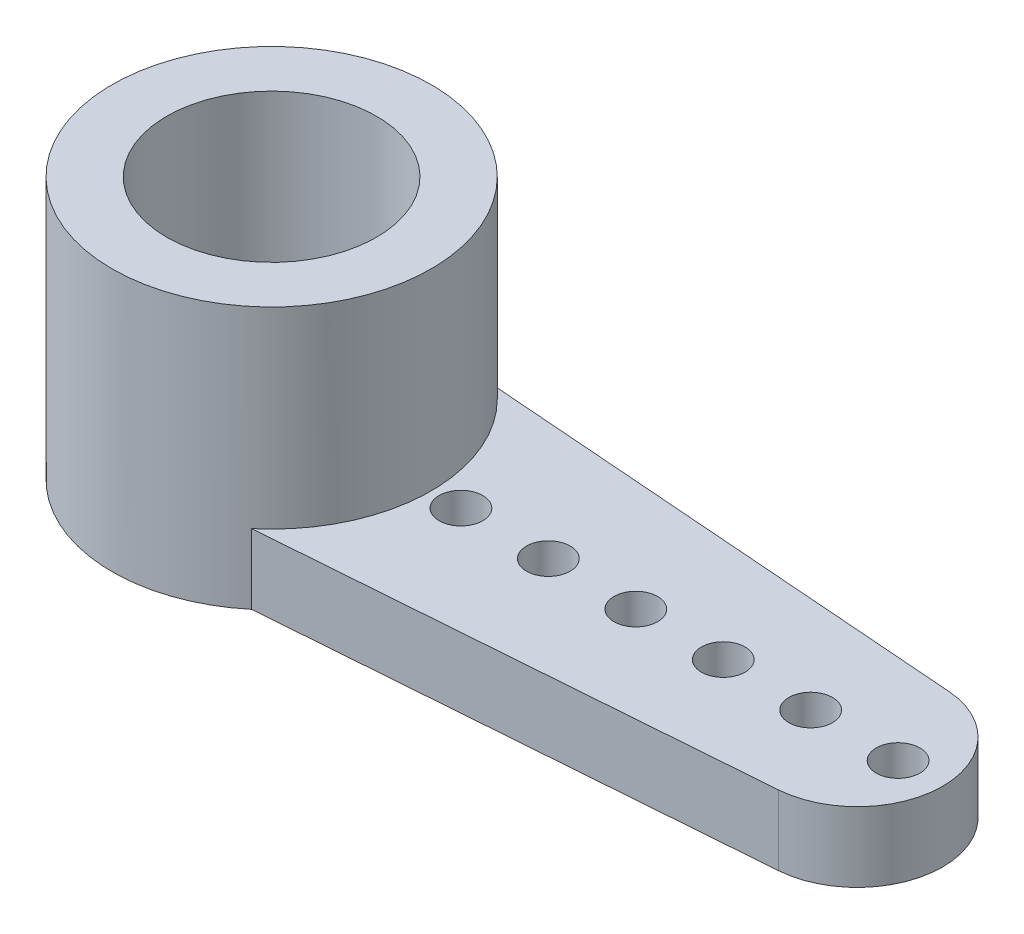
ISO-10303-21;
HEADER;
FILE_DESCRIPTION(('STEP AP214'),'2;1');
FILE_NAME('part.step','',(''),(''),'','','');
FILE_SCHEMA(('AUTOMOTIVE_DESIGN { 1 0 10303 214 1 1 1 1 }'));
ENDSEC;
DATA;
#1=APPLICATION_CONTEXT('core data for automotive mechanical design processes');
#2=APPLICATION_PROTOCOL_DEFINITION('international standard','automotive_design',2000,#1);
#3=PRODUCT_CONTEXT('',#1,'mechanical');
#4=PRODUCT('Part','Part','',(#3));
#5=PRODUCT_RELATED_PRODUCT_CATEGORY('part','',(#4));
#6=PRODUCT_DEFINITION_FORMATION('','',#4);
#7=PRODUCT_DEFINITION_CONTEXT('part definition',#1,'design');
#8=PRODUCT_DEFINITION('design','',#6,#7);
#9=PRODUCT_DEFINITION_SHAPE('','',#8);
#10=(LENGTH_UNIT() NAMED_UNIT(*) SI_UNIT(.MILLI.,.METRE.));
#11=(NAMED_UNIT(*) PLANE_ANGLE_UNIT() SI_UNIT($,.RADIAN.));
#12=(NAMED_UNIT(*) SI_UNIT($,.STERADIAN.) SOLID_ANGLE_UNIT());
#13=UNCERTAINTY_MEASURE_WITH_UNIT(LENGTH_MEASURE(1.E-05),#10,'distance_accuracy_value','');
#14=(GEOMETRIC_REPRESENTATION_CONTEXT(3) GLOBAL_UNCERTAINTY_ASSIGNED_CONTEXT((#13)) GLOBAL_UNIT_ASSIGNED_CONTEXT((#10,
#11,#12)) REPRESENTATION_CONTEXT('',''));
#15=CARTESIAN_POINT('',(0.,0.,0.));
#16=DIRECTION('',(0.,0.,1.));
#17=DIRECTION('',(1.,0.,0.));
#18=AXIS2_PLACEMENT_3D('',#15,#16,#17);
#19=CARTESIAN_POINT('',(0.,0.,0.));
#20=DIRECTION('',(0.,1.,0.));
#21=DIRECTION('',(0.,0.,1.));
#22=AXIS2_PLACEMENT_3D('',#19,#20,#21);
#23=PLANE('',#22);
#24=DIRECTION('',(-0.997132976183473,0.,0.0756691998602467));
#25=VECTOR('',#24,1.);
#26=CARTESIAN_POINT('',(0.12354605445424,0.,1.62803155314454));
#27=LINE('',#26,#25);
#28=CARTESIAN_POINT('',(-4.11920206820452,0.,1.95));
#29=VERTEX_POINT('',#28);
#30=CARTESIAN_POINT('',(-15.3201006018393,0.,2.8));
#31=VERTEX_POINT('',#30);
#32=EDGE_CURVE('E142',#29,#31,#27,.T.);
#33=ORIENTED_EDGE('',*,*,#32,.T.);
#34=CARTESIAN_POINT('',(-17.6615744966329,0.,0.));
#35=DIRECTION('',(0.,1.,0.));
#36=DIRECTION('',(0.,0.,1.));
#37=AXIS2_PLACEMENT_3D('',#34,#35,#36);
#38=CIRCLE('',#37,3.65);
#39=CARTESIAN_POINT('',(-15.3201006018393,0.,-2.8));
#40=VERTEX_POINT('',#39);
#41=EDGE_CURVE('E107',#40,#31,#38,.T.);
#42=ORIENTED_EDGE('',*,*,#41,.F.);
#43=DIRECTION('',(0.997132976183473,0.,0.0756691998602467));
#44=VECTOR('',#43,1.);
#45=CARTESIAN_POINT('',(0.12354605445424,0.,-1.62803155314454));
#46=LINE('',#45,#44);
#47=CARTESIAN_POINT('',(-4.11920206820452,0.,-1.95));
#48=VERTEX_POINT('',#47);
#49=EDGE_CURVE('E147',#40,#48,#46,.T.);
#50=ORIENTED_EDGE('',*,*,#49,.T.);
#51=CARTESIAN_POINT('',(-4.26718126782166,0.,0.));
#52=DIRECTION('',(0.,1.,0.));
#53=DIRECTION('',(0.,0.,1.));
#54=AXIS2_PLACEMENT_3D('',#51,#52,#53);
#55=CIRCLE('',#54,1.95560677118876);
#56=EDGE_CURVE('E144',#48,#29,#55,.F.);
#57=ORIENTED_EDGE('',*,*,#56,.T.);
#58=EDGE_LOOP('',(#33,#42,#50,#57));
#59=FACE_BOUND('',#58,.T.);
#60=CARTESIAN_POINT('',(-3.3314008037869,0.,0.));
#61=DIRECTION('',(0.,1.,0.));
#62=DIRECTION('',(0.,0.,1.));
#63=AXIS2_PLACEMENT_3D('',#60,#61,#62);
#64=CIRCLE('',#63,0.5);
#65=CARTESIAN_POINT('',(-3.3314008037869,0.,0.5));
#66=VERTEX_POINT('',#65);
#67=EDGE_CURVE('E103',#66,#66,#64,.T.);
#68=ORIENTED_EDGE('',*,*,#67,.T.);
#69=EDGE_LOOP('',(#68));
#70=FACE_BOUND('',#69,.T.);
#71=CARTESIAN_POINT('',(-5.3314008037869,0.,0.));
#72=DIRECTION('',(0.,1.,0.));
#73=DIRECTION('',(0.,0.,1.));
#74=AXIS2_PLACEMENT_3D('',#71,#72,#73);
#75=CIRCLE('',#74,0.5);
#76=CARTESIAN_POINT('',(-5.3314008037869,0.,0.500000000000014));
#77=VERTEX_POINT('',#76);
#78=EDGE_CURVE('E162',#77,#77,#75,.T.);
#79=ORIENTED_EDGE('',*,*,#78,.T.);
#80=EDGE_LOOP('',(#79));
#81=FACE_BOUND('',#80,.T.);
#82=CARTESIAN_POINT('',(-7.3314008037869,0.,0.));
#83=DIRECTION('',(0.,1.,0.));
#84=DIRECTION('',(0.,0.,1.));
#85=AXIS2_PLACEMENT_3D('',#82,#83,#84);
#86=CIRCLE('',#85,0.500000000000001);
#87=CARTESIAN_POINT('',(-7.3314008037869,0.,0.500000000000029));
#88=VERTEX_POINT('',#87);
#89=EDGE_CURVE('E159',#88,#88,#86,.T.);
#90=ORIENTED_EDGE('',*,*,#89,.T.);
#91=EDGE_LOOP('',(#90));
#92=FACE_BOUND('',#91,.T.);
#93=CARTESIAN_POINT('',(-9.3314008037869,0.,0.));
#94=DIRECTION('',(0.,1.,0.));
#95=DIRECTION('',(0.,0.,1.));
#96=AXIS2_PLACEMENT_3D('',#93,#94,#95);
#97=CIRCLE('',#96,0.500000000000001);
#98=CARTESIAN_POINT('',(-9.3314008037869,0.,0.500000000000043));
#99=VERTEX_POINT('',#98);
#100=EDGE_CURVE('E156',#99,#99,#97,.T.);
#101=ORIENTED_EDGE('',*,*,#100,.T.);
#102=EDGE_LOOP('',(#101));
#103=FACE_BOUND('',#102,.T.);
#104=CARTESIAN_POINT('',(-11.3314008037869,0.,0.));
#105=DIRECTION('',(0.,1.,0.));
#106=DIRECTION('',(0.,0.,1.));
#107=AXIS2_PLACEMENT_3D('',#104,#105,#106);
#108=CIRCLE('',#107,0.500000000000001);
#109=CARTESIAN_POINT('',(-11.3314008037869,0.,0.500000000000057));
#110=VERTEX_POINT('',#109);
#111=EDGE_CURVE('E153',#110,#110,#108,.T.);
#112=ORIENTED_EDGE('',*,*,#111,.T.);
#113=EDGE_LOOP('',(#112));
#114=FACE_BOUND('',#113,.T.);
#115=CARTESIAN_POINT('',(-13.3314008037869,0.,0.));
#116=DIRECTION('',(0.,1.,0.));
#117=DIRECTION('',(0.,0.,1.));
#118=AXIS2_PLACEMENT_3D('',#115,#116,#117);
#119=CIRCLE('',#118,0.500000000000001);
#120=CARTESIAN_POINT('',(-13.3314008037869,0.,0.500000000000071));
#121=VERTEX_POINT('',#120);
#122=EDGE_CURVE('E150',#121,#121,#119,.T.);
#123=ORIENTED_EDGE('',*,*,#122,.T.);
#124=EDGE_LOOP('',(#123));
#125=FACE_BOUND('',#124,.T.);
#126=CARTESIAN_POINT('',(-17.6615744966329,0.,0.));
#127=DIRECTION('',(0.,1.,0.));
#128=DIRECTION('',(0.,0.,1.));
#129=AXIS2_PLACEMENT_3D('',#126,#127,#128);
#130=CIRCLE('',#129,2.4);
#131=CARTESIAN_POINT('',(-17.6615744966329,0.,2.4));
#132=VERTEX_POINT('',#131);
#133=EDGE_CURVE('E223',#132,#132,#130,.T.);
#134=ORIENTED_EDGE('',*,*,#133,.T.);
#135=EDGE_LOOP('',(#134));
#136=FACE_BOUND('',#135,.T.);
#137=ADVANCED_FACE('F49',(#59,#70,#81,#92,#103,#114,#125,#136),#23,.F.);
#138=CARTESIAN_POINT('',(0.,1.6,0.));
#139=DIRECTION('',(0.,1.,0.));
#140=DIRECTION('',(0.,0.,1.));
#141=AXIS2_PLACEMENT_3D('',#138,#139,#140);
#142=PLANE('',#141);
#143=CARTESIAN_POINT('',(-13.3314008037869,1.6,0.));
#144=DIRECTION('',(0.,1.,0.));
#145=DIRECTION('',(0.,0.,1.));
#146=AXIS2_PLACEMENT_3D('',#143,#144,#145);
#147=CIRCLE('',#146,0.500000000000001);
#148=CARTESIAN_POINT('',(-13.3314008037869,1.6,0.500000000000071));
#149=VERTEX_POINT('',#148);
#150=EDGE_CURVE('E123',#149,#149,#147,.T.);
#151=ORIENTED_EDGE('',*,*,#150,.F.);
#152=EDGE_LOOP('',(#151));
#153=FACE_BOUND('',#152,.T.);
#154=CARTESIAN_POINT('',(-11.3314008037869,1.6,0.));
#155=DIRECTION('',(0.,1.,0.));
#156=DIRECTION('',(0.,0.,1.));
#157=AXIS2_PLACEMENT_3D('',#154,#155,#156);
#158=CIRCLE('',#157,0.500000000000001);
#159=CARTESIAN_POINT('',(-11.3314008037869,1.6,0.500000000000057));
#160=VERTEX_POINT('',#159);
#161=EDGE_CURVE('E126',#160,#160,#158,.T.);
#162=ORIENTED_EDGE('',*,*,#161,.F.);
#163=EDGE_LOOP('',(#162));
#164=FACE_BOUND('',#163,.T.);
#165=CARTESIAN_POINT('',(-9.3314008037869,1.6,0.));
#166=DIRECTION('',(0.,1.,0.));
#167=DIRECTION('',(0.,0.,1.));
#168=AXIS2_PLACEMENT_3D('',#165,#166,#167);
#169=CIRCLE('',#168,0.500000000000001);
#170=CARTESIAN_POINT('',(-9.3314008037869,1.6,0.500000000000043));
#171=VERTEX_POINT('',#170);
#172=EDGE_CURVE('E129',#171,#171,#169,.T.);
#173=ORIENTED_EDGE('',*,*,#172,.F.);
#174=EDGE_LOOP('',(#173));
#175=FACE_BOUND('',#174,.T.);
#176=CARTESIAN_POINT('',(-7.3314008037869,1.6,0.));
#177=DIRECTION('',(0.,1.,0.));
#178=DIRECTION('',(0.,0.,1.));
#179=AXIS2_PLACEMENT_3D('',#176,#177,#178);
#180=CIRCLE('',#179,0.500000000000001);
#181=CARTESIAN_POINT('',(-7.3314008037869,1.6,0.500000000000029));
#182=VERTEX_POINT('',#181);
#183=EDGE_CURVE('E132',#182,#182,#180,.T.);
#184=ORIENTED_EDGE('',*,*,#183,.F.);
#185=EDGE_LOOP('',(#184));
#186=FACE_BOUND('',#185,.T.);
#187=CARTESIAN_POINT('',(-5.3314008037869,1.6,0.));
#188=DIRECTION('',(0.,1.,0.));
#189=DIRECTION('',(0.,0.,1.));
#190=AXIS2_PLACEMENT_3D('',#187,#188,#189);
#191=CIRCLE('',#190,0.5);
#192=CARTESIAN_POINT('',(-5.3314008037869,1.6,0.500000000000014));
#193=VERTEX_POINT('',#192);
#194=EDGE_CURVE('E135',#193,#193,#191,.T.);
#195=ORIENTED_EDGE('',*,*,#194,.F.);
#196=EDGE_LOOP('',(#195));
#197=FACE_BOUND('',#196,.T.);
#198=CARTESIAN_POINT('',(-3.3314008037869,1.6,0.));
#199=DIRECTION('',(0.,1.,0.));
#200=DIRECTION('',(0.,0.,1.));
#201=AXIS2_PLACEMENT_3D('',#198,#199,#200);
#202=CIRCLE('',#201,0.5);
#203=CARTESIAN_POINT('',(-3.3314008037869,1.6,0.5));
#204=VERTEX_POINT('',#203);
#205=EDGE_CURVE('E138',#204,#204,#202,.T.);
#206=ORIENTED_EDGE('',*,*,#205,.F.);
#207=EDGE_LOOP('',(#206));
#208=FACE_BOUND('',#207,.T.);
#209=DIRECTION('',(0.997132976183473,0.,0.0756691998602467));
#210=VECTOR('',#209,1.);
#211=CARTESIAN_POINT('',(0.12354605445424,1.6,-1.62803155314454));
#212=LINE('',#211,#210);
#213=CARTESIAN_POINT('',(-15.3201006018393,1.6,-2.8));
#214=VERTEX_POINT('',#213);
#215=CARTESIAN_POINT('',(-4.11920206820452,1.6,-1.95));
#216=VERTEX_POINT('',#215);
#217=EDGE_CURVE('E110',#214,#216,#212,.T.);
#218=ORIENTED_EDGE('',*,*,#217,.F.);
#219=CARTESIAN_POINT('',(-17.6615744966329,1.6,0.));
#220=DIRECTION('',(0.,1.,0.));
#221=DIRECTION('',(0.,0.,1.));
#222=AXIS2_PLACEMENT_3D('',#219,#220,#221);
#223=CIRCLE('',#222,3.65);
#224=CARTESIAN_POINT('',(-15.3201006018393,1.6,2.8));
#225=VERTEX_POINT('',#224);
#226=EDGE_CURVE('E106',#214,#225,#223,.F.);
#227=ORIENTED_EDGE('',*,*,#226,.T.);
#228=DIRECTION('',(-0.997132976183473,0.,0.0756691998602467));
#229=VECTOR('',#228,1.);
#230=CARTESIAN_POINT('',(0.12354605445424,1.6,1.62803155314454));
#231=LINE('',#230,#229);
#232=CARTESIAN_POINT('',(-4.11920206820452,1.6,1.95));
#233=VERTEX_POINT('',#232);
#234=EDGE_CURVE('E95',#233,#225,#231,.T.);
#235=ORIENTED_EDGE('',*,*,#234,.F.);
#236=CARTESIAN_POINT('',(-4.26718126782166,1.6,0.));
#237=DIRECTION('',(0.,1.,0.));
#238=DIRECTION('',(0.,0.,1.));
#239=AXIS2_PLACEMENT_3D('',#236,#237,#238);
#240=CIRCLE('',#239,1.95560677118876);
#241=EDGE_CURVE('E102',#216,#233,#240,.F.);
#242=ORIENTED_EDGE('',*,*,#241,.F.);
#243=EDGE_LOOP('',(#218,#227,#235,#242));
#244=FACE_BOUND('',#243,.T.);
#245=ADVANCED_FACE('F109',(#153,#164,#175,#186,#197,#208,#244),#142,.T.);
#246=CARTESIAN_POINT('',(-17.6615744966329,1.6,0.));
#247=DIRECTION('',(0.,1.,0.));
#248=DIRECTION('',(0.,0.,1.));
#249=AXIS2_PLACEMENT_3D('',#246,#247,#248);
#250=CIRCLE('',#249,2.4);
#251=CARTESIAN_POINT('',(-17.6615744966329,1.6,2.4));
#252=VERTEX_POINT('',#251);
#253=EDGE_CURVE('E12',#252,#252,#250,.F.);
#254=ORIENTED_EDGE('',*,*,#253,.F.);
#255=EDGE_LOOP('',(#254));
#256=FACE_BOUND('',#255,.T.);
#257=CARTESIAN_POINT('',(-17.6615744966329,1.6,0.));
#258=DIRECTION('',(0.,1.,0.));
#259=DIRECTION('',(0.,0.,1.));
#260=AXIS2_PLACEMENT_3D('',#257,#258,#259);
#261=CIRCLE('',#260,1.6);
#262=CARTESIAN_POINT('',(-17.6615744966329,1.6,1.6));
#263=VERTEX_POINT('',#262);
#264=EDGE_CURVE('E111',#263,#263,#261,.T.);
#265=ORIENTED_EDGE('',*,*,#264,.F.);
#266=EDGE_LOOP('',(#265));
#267=FACE_BOUND('',#266,.T.);
#268=ADVANCED_FACE('F193',(#256,#267),#142,.T.);
#269=CARTESIAN_POINT('',(-17.6615744966329,1.6,0.));
#270=DIRECTION('',(0.,-1.,0.));
#271=DIRECTION('',(0.,0.,-1.));
#272=AXIS2_PLACEMENT_3D('',#269,#270,#271);
#273=CYLINDRICAL_SURFACE('',#272,3.65);
#274=ORIENTED_EDGE('',*,*,#41,.T.);
#275=DIRECTION('',(0.,-1.,0.));
#276=VECTOR('',#275,1.);
#277=CARTESIAN_POINT('',(-15.3201006018393,1.6,2.8));
#278=LINE('',#277,#276);
#279=EDGE_CURVE('E53',#225,#31,#278,.T.);
#280=ORIENTED_EDGE('',*,*,#279,.F.);
#281=ORIENTED_EDGE('',*,*,#226,.F.);
#282=DIRECTION('',(0.,-1.,0.));
#283=VECTOR('',#282,1.);
#284=CARTESIAN_POINT('',(-15.3201006018393,1.6,-2.8));
#285=LINE('',#284,#283);
#286=EDGE_CURVE('E67',#214,#40,#285,.T.);
#287=ORIENTED_EDGE('',*,*,#286,.T.);
#288=EDGE_LOOP('',(#274,#280,#281,#287));
#289=FACE_BOUND('',#288,.T.);
#290=CARTESIAN_POINT('',(-17.6615744966329,6.,0.));
#291=DIRECTION('',(0.,1.,0.));
#292=DIRECTION('',(0.,0.,1.));
#293=AXIS2_PLACEMENT_3D('',#290,#291,#292);
#294=CIRCLE('',#293,3.65);
#295=CARTESIAN_POINT('',(-17.6615744966329,6.,3.65));
#296=VERTEX_POINT('',#295);
#297=EDGE_CURVE('E112',#296,#296,#294,.T.);
#298=ORIENTED_EDGE('',*,*,#297,.F.);
#299=EDGE_LOOP('',(#298));
#300=FACE_BOUND('',#299,.T.);
#301=ADVANCED_FACE('F51',(#289,#300),#273,.T.);
#302=CARTESIAN_POINT('',(0.12354605445424,1.6,1.62803155314454));
#303=DIRECTION('',(0.0756691998602467,0.,0.997132976183473));
#304=DIRECTION('',(0.997132976183473,0.,-0.0756691998602467));
#305=AXIS2_PLACEMENT_3D('',#302,#303,#304);
#306=PLANE('',#305);
#307=ORIENTED_EDGE('',*,*,#32,.F.);
#308=DIRECTION('',(0.,-1.,0.));
#309=VECTOR('',#308,1.);
#310=CARTESIAN_POINT('',(-4.11920206820452,1.6,1.95));
#311=LINE('',#310,#309);
#312=EDGE_CURVE('E92',#233,#29,#311,.T.);
#313=ORIENTED_EDGE('',*,*,#312,.F.);
#314=ORIENTED_EDGE('',*,*,#234,.T.);
#315=ORIENTED_EDGE('',*,*,#279,.T.);
#316=EDGE_LOOP('',(#307,#313,#314,#315));
#317=FACE_BOUND('',#316,.T.);
#318=ADVANCED_FACE('F97',(#317),#306,.T.);
#319=CARTESIAN_POINT('',(-4.26718126782166,1.6,0.));
#320=DIRECTION('',(0.,-1.,0.));
#321=DIRECTION('',(0.,0.,-1.));
#322=AXIS2_PLACEMENT_3D('',#319,#320,#321);
#323=CYLINDRICAL_SURFACE('',#322,1.95560677118876);
#324=ORIENTED_EDGE('',*,*,#56,.F.);
#325=DIRECTION('',(0.,-1.,0.));
#326=VECTOR('',#325,1.);
#327=CARTESIAN_POINT('',(-4.11920206820452,1.6,-1.95));
#328=LINE('',#327,#326);
#329=EDGE_CURVE('E82',#216,#48,#328,.T.);
#330=ORIENTED_EDGE('',*,*,#329,.F.);
#331=ORIENTED_EDGE('',*,*,#241,.T.);
#332=ORIENTED_EDGE('',*,*,#312,.T.);
#333=EDGE_LOOP('',(#324,#330,#331,#332));
#334=FACE_BOUND('',#333,.T.);
#335=ADVANCED_FACE('F169',(#334),#323,.T.);
#336=CARTESIAN_POINT('',(-5.3314008037869,1.6,0.));
#337=DIRECTION('',(0.,-1.,0.));
#338=DIRECTION('',(0.,0.,-1.));
#339=AXIS2_PLACEMENT_3D('',#336,#337,#338);
#340=CYLINDRICAL_SURFACE('',#339,0.5);
#341=ORIENTED_EDGE('',*,*,#194,.T.);
#342=EDGE_LOOP('',(#341));
#343=FACE_BOUND('',#342,.T.);
#344=ORIENTED_EDGE('',*,*,#78,.F.);
#345=EDGE_LOOP('',(#344));
#346=FACE_BOUND('',#345,.T.);
#347=ADVANCED_FACE('F198',(#343,#346),#340,.F.);
#348=CARTESIAN_POINT('',(-7.3314008037869,1.6,0.));
#349=DIRECTION('',(0.,-1.,0.));
#350=DIRECTION('',(0.,0.,-1.));
#351=AXIS2_PLACEMENT_3D('',#348,#349,#350);
#352=CYLINDRICAL_SURFACE('',#351,0.500000000000001);
#353=ORIENTED_EDGE('',*,*,#183,.T.);
#354=EDGE_LOOP('',(#353));
#355=FACE_BOUND('',#354,.T.);
#356=ORIENTED_EDGE('',*,*,#89,.F.);
#357=EDGE_LOOP('',(#356));
#358=FACE_BOUND('',#357,.T.);
#359=ADVANCED_FACE('F201',(#355,#358),#352,.F.);
#360=CARTESIAN_POINT('',(-9.3314008037869,1.6,0.));
#361=DIRECTION('',(0.,-1.,0.));
#362=DIRECTION('',(0.,0.,-1.));
#363=AXIS2_PLACEMENT_3D('',#360,#361,#362);
#364=CYLINDRICAL_SURFACE('',#363,0.500000000000001);
#365=ORIENTED_EDGE('',*,*,#172,.T.);
#366=EDGE_LOOP('',(#365));
#367=FACE_BOUND('',#366,.T.);
#368=ORIENTED_EDGE('',*,*,#100,.F.);
#369=EDGE_LOOP('',(#368));
#370=FACE_BOUND('',#369,.T.);
#371=ADVANCED_FACE('F205',(#367,#370),#364,.F.);
#372=CARTESIAN_POINT('',(-11.3314008037869,1.6,0.));
#373=DIRECTION('',(0.,-1.,0.));
#374=DIRECTION('',(0.,0.,-1.));
#375=AXIS2_PLACEMENT_3D('',#372,#373,#374);
#376=CYLINDRICAL_SURFACE('',#375,0.500000000000001);
#377=ORIENTED_EDGE('',*,*,#161,.T.);
#378=EDGE_LOOP('',(#377));
#379=FACE_BOUND('',#378,.T.);
#380=ORIENTED_EDGE('',*,*,#111,.F.);
#381=EDGE_LOOP('',(#380));
#382=FACE_BOUND('',#381,.T.);
#383=ADVANCED_FACE('F184',(#379,#382),#376,.F.);
#384=CARTESIAN_POINT('',(-13.3314008037869,1.6,0.));
#385=DIRECTION('',(0.,-1.,0.));
#386=DIRECTION('',(0.,0.,-1.));
#387=AXIS2_PLACEMENT_3D('',#384,#385,#386);
#388=CYLINDRICAL_SURFACE('',#387,0.500000000000001);
#389=ORIENTED_EDGE('',*,*,#150,.T.);
#390=EDGE_LOOP('',(#389));
#391=FACE_BOUND('',#390,.T.);
#392=ORIENTED_EDGE('',*,*,#122,.F.);
#393=EDGE_LOOP('',(#392));
#394=FACE_BOUND('',#393,.T.);
#395=ADVANCED_FACE('F175',(#391,#394),#388,.F.);
#396=CARTESIAN_POINT('',(0.12354605445424,1.6,-1.62803155314454));
#397=DIRECTION('',(0.0756691998602467,0.,-0.997132976183473));
#398=DIRECTION('',(-0.997132976183473,0.,-0.0756691998602467));
#399=AXIS2_PLACEMENT_3D('',#396,#397,#398);
#400=PLANE('',#399);
#401=ORIENTED_EDGE('',*,*,#49,.F.);
#402=ORIENTED_EDGE('',*,*,#286,.F.);
#403=ORIENTED_EDGE('',*,*,#217,.T.);
#404=ORIENTED_EDGE('',*,*,#329,.T.);
#405=EDGE_LOOP('',(#401,#402,#403,#404));
#406=FACE_BOUND('',#405,.T.);
#407=ADVANCED_FACE('F172',(#406),#400,.T.);
#408=CARTESIAN_POINT('',(-3.3314008037869,1.6,0.));
#409=DIRECTION('',(0.,-1.,0.));
#410=DIRECTION('',(0.,0.,-1.));
#411=AXIS2_PLACEMENT_3D('',#408,#409,#410);
#412=CYLINDRICAL_SURFACE('',#411,0.5);
#413=ORIENTED_EDGE('',*,*,#205,.T.);
#414=EDGE_LOOP('',(#413));
#415=FACE_BOUND('',#414,.T.);
#416=ORIENTED_EDGE('',*,*,#67,.F.);
#417=EDGE_LOOP('',(#416));
#418=FACE_BOUND('',#417,.T.);
#419=ADVANCED_FACE('F174',(#415,#418),#412,.F.);
#420=CARTESIAN_POINT('',(-17.6615744966329,1.6,0.));
#421=DIRECTION('',(0.,-1.,0.));
#422=DIRECTION('',(0.,0.,-1.));
#423=AXIS2_PLACEMENT_3D('',#420,#421,#422);
#424=CYLINDRICAL_SURFACE('',#423,1.6);
#425=CARTESIAN_POINT('',(-17.6615744966329,1.,0.));
#426=DIRECTION('',(0.,1.,0.));
#427=DIRECTION('',(0.,0.,1.));
#428=AXIS2_PLACEMENT_3D('',#425,#426,#427);
#429=CIRCLE('',#428,1.6);
#430=CARTESIAN_POINT('',(-17.6615744966329,1.,1.6));
#431=VERTEX_POINT('',#430);
#432=EDGE_CURVE('E225',#431,#431,#429,.T.);
#433=ORIENTED_EDGE('',*,*,#432,.F.);
#434=EDGE_LOOP('',(#433));
#435=FACE_BOUND('',#434,.T.);
#436=ORIENTED_EDGE('',*,*,#264,.T.);
#437=EDGE_LOOP('',(#436));
#438=FACE_BOUND('',#437,.T.);
#439=ADVANCED_FACE('F181',(#435,#438),#424,.F.);
#440=CARTESIAN_POINT('',(-17.6615744966329,6.,0.));
#441=DIRECTION('',(0.,-1.,0.));
#442=DIRECTION('',(0.,0.,-1.));
#443=AXIS2_PLACEMENT_3D('',#440,#441,#442);
#444=CYLINDRICAL_SURFACE('',#443,2.4);
#445=ORIENTED_EDGE('',*,*,#253,.T.);
#446=EDGE_LOOP('',(#445));
#447=FACE_BOUND('',#446,.T.);
#448=CARTESIAN_POINT('',(-17.6615744966329,6.,0.));
#449=DIRECTION('',(0.,1.,0.));
#450=DIRECTION('',(0.,0.,1.));
#451=AXIS2_PLACEMENT_3D('',#448,#449,#450);
#452=CIRCLE('',#451,2.4);
#453=CARTESIAN_POINT('',(-17.6615744966329,6.,2.4));
#454=VERTEX_POINT('',#453);
#455=EDGE_CURVE('E117',#454,#454,#452,.T.);
#456=ORIENTED_EDGE('',*,*,#455,.T.);
#457=EDGE_LOOP('',(#456));
#458=FACE_BOUND('',#457,.T.);
#459=ADVANCED_FACE('F251',(#447,#458),#444,.F.);
#460=CARTESIAN_POINT('',(0.,6.,0.));
#461=DIRECTION('',(0.,1.,0.));
#462=DIRECTION('',(0.,0.,1.));
#463=AXIS2_PLACEMENT_3D('',#460,#461,#462);
#464=PLANE('',#463);
#465=ORIENTED_EDGE('',*,*,#455,.F.);
#466=EDGE_LOOP('',(#465));
#467=FACE_BOUND('',#466,.T.);
#468=ORIENTED_EDGE('',*,*,#297,.T.);
#469=EDGE_LOOP('',(#468));
#470=FACE_BOUND('',#469,.T.);
#471=ADVANCED_FACE('F246',(#467,#470),#464,.T.);
#472=CARTESIAN_POINT('',(-17.6615744966329,1.,0.));
#473=DIRECTION('',(0.,-1.,0.));
#474=DIRECTION('',(0.,0.,-1.));
#475=AXIS2_PLACEMENT_3D('',#472,#473,#474);
#476=CYLINDRICAL_SURFACE('',#475,2.4);
#477=CARTESIAN_POINT('',(-17.6615744966329,1.,0.));
#478=DIRECTION('',(0.,1.,0.));
#479=DIRECTION('',(0.,0.,1.));
#480=AXIS2_PLACEMENT_3D('',#477,#478,#479);
#481=CIRCLE('',#480,2.4);
#482=CARTESIAN_POINT('',(-17.6615744966329,1.,2.4));
#483=VERTEX_POINT('',#482);
#484=EDGE_CURVE('E228',#483,#483,#481,.T.);
#485=ORIENTED_EDGE('',*,*,#484,.T.);
#486=EDGE_LOOP('',(#485));
#487=FACE_BOUND('',#486,.T.);
#488=ORIENTED_EDGE('',*,*,#133,.F.);
#489=EDGE_LOOP('',(#488));
#490=FACE_BOUND('',#489,.T.);
#491=ADVANCED_FACE('F237',(#487,#490),#476,.F.);
#492=CARTESIAN_POINT('',(0.,1.,0.));
#493=DIRECTION('',(0.,1.,0.));
#494=DIRECTION('',(0.,0.,1.));
#495=AXIS2_PLACEMENT_3D('',#492,#493,#494);
#496=PLANE('',#495);
#497=ORIENTED_EDGE('',*,*,#432,.T.);
#498=EDGE_LOOP('',(#497));
#499=FACE_BOUND('',#498,.T.);
#500=ORIENTED_EDGE('',*,*,#484,.F.);
#501=EDGE_LOOP('',(#500));
#502=FACE_BOUND('',#501,.T.);
#503=ADVANCED_FACE('F239',(#499,#502),#496,.F.);
#504=CLOSED_SHELL('',(#137,#245,#268,#301,#318,#335,#347,#359,#371,#383,#395,#407,#419,#439,
#459,#471,#491,#503));
#505=MANIFOLD_SOLID_BREP('B2',#504);
#506=ADVANCED_BREP_SHAPE_REPRESENTATION('',(#18,#505),#14);
#507=SHAPE_DEFINITION_REPRESENTATION(#9,#506);
ENDSEC;
END-ISO-10303-21;
